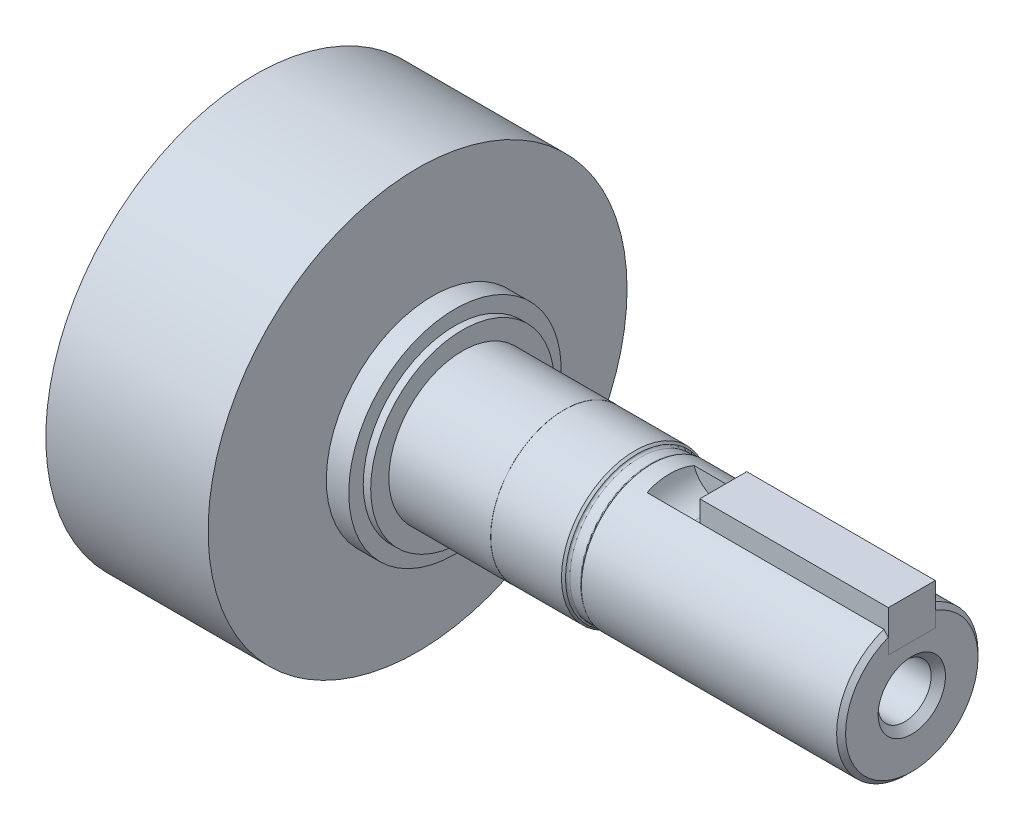
ISO-10303-21;
HEADER;
FILE_DESCRIPTION(('STEP AP214'),'2;1');
FILE_NAME('part.step','',(''),(''),'','','');
FILE_SCHEMA(('AUTOMOTIVE_DESIGN { 1 0 10303 214 1 1 1 1 }'));
ENDSEC;
DATA;
#1=APPLICATION_CONTEXT('core data for automotive mechanical design processes');
#2=APPLICATION_PROTOCOL_DEFINITION('international standard','automotive_design',2000,#1);
#3=PRODUCT_CONTEXT('',#1,'mechanical');
#4=PRODUCT('Part','Part','',(#3));
#5=PRODUCT_RELATED_PRODUCT_CATEGORY('part','',(#4));
#6=PRODUCT_DEFINITION_FORMATION('','',#4);
#7=PRODUCT_DEFINITION_CONTEXT('part definition',#1,'design');
#8=PRODUCT_DEFINITION('design','',#6,#7);
#9=PRODUCT_DEFINITION_SHAPE('','',#8);
#10=(LENGTH_UNIT() NAMED_UNIT(*) SI_UNIT(.MILLI.,.METRE.));
#11=(NAMED_UNIT(*) PLANE_ANGLE_UNIT() SI_UNIT($,.RADIAN.));
#12=(NAMED_UNIT(*) SI_UNIT($,.STERADIAN.) SOLID_ANGLE_UNIT());
#13=UNCERTAINTY_MEASURE_WITH_UNIT(LENGTH_MEASURE(1.E-05),#10,'distance_accuracy_value','');
#14=(GEOMETRIC_REPRESENTATION_CONTEXT(3) GLOBAL_UNCERTAINTY_ASSIGNED_CONTEXT((#13)) GLOBAL_UNIT_ASSIGNED_CONTEXT((#10,
#11,#12)) REPRESENTATION_CONTEXT('',''));
#15=CARTESIAN_POINT('',(0.,0.,0.));
#16=DIRECTION('',(0.,0.,1.));
#17=DIRECTION('',(1.,0.,0.));
#18=AXIS2_PLACEMENT_3D('',#15,#16,#17);
#19=CARTESIAN_POINT('',(-32.004,7.8994,3.9878));
#20=DIRECTION('',(0.,0.,1.));
#21=DIRECTION('',(1.,0.,0.));
#22=AXIS2_PLACEMENT_3D('',#19,#20,#21);
#23=PLANE('',#22);
#24=DIRECTION('',(0.,-1.,0.));
#25=VECTOR('',#24,1.);
#26=CARTESIAN_POINT('',(0.,7.8994,3.9878));
#27=LINE('',#26,#25);
#28=CARTESIAN_POINT('',(0.,14.8844,3.9878));
#29=VERTEX_POINT('',#28);
#30=CARTESIAN_POINT('',(0.,7.8994,3.9878));
#31=VERTEX_POINT('',#30);
#32=EDGE_CURVE('E108',#29,#31,#27,.T.);
#33=ORIENTED_EDGE('',*,*,#32,.F.);
#34=DIRECTION('',(1.,0.,0.));
#35=VECTOR('',#34,1.);
#36=CARTESIAN_POINT('',(-32.004,14.8844,3.9878));
#37=LINE('',#36,#35);
#38=CARTESIAN_POINT('',(-32.004,14.8844,3.9878));
#39=VERTEX_POINT('',#38);
#40=EDGE_CURVE('E12',#39,#29,#37,.T.);
#41=ORIENTED_EDGE('',*,*,#40,.F.);
#42=DIRECTION('',(0.,-1.,0.));
#43=VECTOR('',#42,1.);
#44=CARTESIAN_POINT('',(-32.004,7.8994,3.9878));
#45=LINE('',#44,#43);
#46=CARTESIAN_POINT('',(-32.004,7.8994,3.9878));
#47=VERTEX_POINT('',#46);
#48=EDGE_CURVE('E102',#39,#47,#45,.T.);
#49=ORIENTED_EDGE('',*,*,#48,.T.);
#50=DIRECTION('',(1.,0.,0.));
#51=VECTOR('',#50,1.);
#52=CARTESIAN_POINT('',(-32.004,7.8994,3.9878));
#53=LINE('',#52,#51);
#54=EDGE_CURVE('E47',#47,#31,#53,.T.);
#55=ORIENTED_EDGE('',*,*,#54,.T.);
#56=EDGE_LOOP('',(#33,#41,#49,#55));
#57=FACE_BOUND('',#56,.T.);
#58=ADVANCED_FACE('F44',(#57),#23,.T.);
#59=CARTESIAN_POINT('',(-32.004,14.8844,3.9878));
#60=DIRECTION('',(0.,1.,0.));
#61=DIRECTION('',(0.,0.,1.));
#62=AXIS2_PLACEMENT_3D('',#59,#60,#61);
#63=PLANE('',#62);
#64=DIRECTION('',(0.,0.,1.));
#65=VECTOR('',#64,1.);
#66=CARTESIAN_POINT('',(0.,14.8844,3.9878));
#67=LINE('',#66,#65);
#68=CARTESIAN_POINT('',(0.,14.8844,-3.9878));
#69=VERTEX_POINT('',#68);
#70=EDGE_CURVE('E104',#69,#29,#67,.T.);
#71=ORIENTED_EDGE('',*,*,#70,.F.);
#72=DIRECTION('',(1.,0.,0.));
#73=VECTOR('',#72,1.);
#74=CARTESIAN_POINT('',(-32.004,14.8844,-3.9878));
#75=LINE('',#74,#73);
#76=CARTESIAN_POINT('',(-32.004,14.8844,-3.9878));
#77=VERTEX_POINT('',#76);
#78=EDGE_CURVE('E53',#77,#69,#75,.T.);
#79=ORIENTED_EDGE('',*,*,#78,.F.);
#80=DIRECTION('',(0.,0.,1.));
#81=VECTOR('',#80,1.);
#82=CARTESIAN_POINT('',(-32.004,14.8844,3.9878));
#83=LINE('',#82,#81);
#84=EDGE_CURVE('E99',#77,#39,#83,.T.);
#85=ORIENTED_EDGE('',*,*,#84,.T.);
#86=ORIENTED_EDGE('',*,*,#40,.T.);
#87=EDGE_LOOP('',(#71,#79,#85,#86));
#88=FACE_BOUND('',#87,.T.);
#89=ADVANCED_FACE('F118',(#88),#63,.T.);
#90=CARTESIAN_POINT('',(-32.004,7.8994,-3.9878));
#91=DIRECTION('',(0.,0.,-1.));
#92=DIRECTION('',(-1.,0.,0.));
#93=AXIS2_PLACEMENT_3D('',#90,#91,#92);
#94=PLANE('',#93);
#95=DIRECTION('',(0.,1.,0.));
#96=VECTOR('',#95,1.);
#97=CARTESIAN_POINT('',(0.,7.8994,-3.9878));
#98=LINE('',#97,#96);
#99=CARTESIAN_POINT('',(0.,7.8994,-3.9878));
#100=VERTEX_POINT('',#99);
#101=EDGE_CURVE('E94',#100,#69,#98,.T.);
#102=ORIENTED_EDGE('',*,*,#101,.F.);
#103=DIRECTION('',(1.,0.,0.));
#104=VECTOR('',#103,1.);
#105=CARTESIAN_POINT('',(-32.004,7.8994,-3.9878));
#106=LINE('',#105,#104);
#107=CARTESIAN_POINT('',(-32.004,7.8994,-3.9878));
#108=VERTEX_POINT('',#107);
#109=EDGE_CURVE('E89',#108,#100,#106,.T.);
#110=ORIENTED_EDGE('',*,*,#109,.F.);
#111=DIRECTION('',(0.,1.,0.));
#112=VECTOR('',#111,1.);
#113=CARTESIAN_POINT('',(-32.004,7.8994,-3.9878));
#114=LINE('',#113,#112);
#115=EDGE_CURVE('E92',#108,#77,#114,.T.);
#116=ORIENTED_EDGE('',*,*,#115,.T.);
#117=ORIENTED_EDGE('',*,*,#78,.T.);
#118=EDGE_LOOP('',(#102,#110,#116,#117));
#119=FACE_BOUND('',#118,.T.);
#120=ADVANCED_FACE('F91',(#119),#94,.T.);
#121=CARTESIAN_POINT('',(-32.004,7.8994,3.9878));
#122=DIRECTION('',(0.,-1.,0.));
#123=DIRECTION('',(0.,0.,-1.));
#124=AXIS2_PLACEMENT_3D('',#121,#122,#123);
#125=PLANE('',#124);
#126=DIRECTION('',(0.,0.,-1.));
#127=VECTOR('',#126,1.);
#128=CARTESIAN_POINT('',(0.,7.8994,3.9878));
#129=LINE('',#128,#127);
#130=EDGE_CURVE('E111',#31,#100,#129,.T.);
#131=ORIENTED_EDGE('',*,*,#130,.F.);
#132=ORIENTED_EDGE('',*,*,#54,.F.);
#133=DIRECTION('',(0.,0.,-1.));
#134=VECTOR('',#133,1.);
#135=CARTESIAN_POINT('',(-32.004,7.8994,3.9878));
#136=LINE('',#135,#134);
#137=EDGE_CURVE('E98',#47,#108,#136,.T.);
#138=ORIENTED_EDGE('',*,*,#137,.T.);
#139=ORIENTED_EDGE('',*,*,#109,.T.);
#140=EDGE_LOOP('',(#131,#132,#138,#139));
#141=FACE_BOUND('',#140,.T.);
#142=ADVANCED_FACE('F101',(#141),#125,.T.);
#143=CARTESIAN_POINT('',(-32.004,14.8844,3.9878));
#144=DIRECTION('',(-1.,0.,0.));
#145=DIRECTION('',(0.,0.,1.));
#146=AXIS2_PLACEMENT_3D('',#143,#144,#145);
#147=PLANE('',#146);
#148=ORIENTED_EDGE('',*,*,#48,.F.);
#149=ORIENTED_EDGE('',*,*,#84,.F.);
#150=ORIENTED_EDGE('',*,*,#115,.F.);
#151=ORIENTED_EDGE('',*,*,#137,.F.);
#152=EDGE_LOOP('',(#148,#149,#150,#151));
#153=FACE_BOUND('',#152,.T.);
#154=ADVANCED_FACE('F97',(#153),#147,.T.);
#155=CARTESIAN_POINT('',(0.,14.8844,3.9878));
#156=DIRECTION('',(-1.,0.,0.));
#157=DIRECTION('',(0.,0.,1.));
#158=AXIS2_PLACEMENT_3D('',#155,#156,#157);
#159=PLANE('',#158);
#160=ORIENTED_EDGE('',*,*,#32,.T.);
#161=ORIENTED_EDGE('',*,*,#130,.T.);
#162=ORIENTED_EDGE('',*,*,#101,.T.);
#163=ORIENTED_EDGE('',*,*,#70,.T.);
#164=EDGE_LOOP('',(#160,#161,#162,#163));
#165=FACE_BOUND('',#164,.T.);
#166=ADVANCED_FACE('F117',(#165),#159,.F.);
#167=CLOSED_SHELL('',(#58,#89,#120,#142,#154,#166));
#168=MANIFOLD_SOLID_BREP('B2',#167);
#169=CARTESIAN_POINT('',(-76.2762,0.,0.));
#170=DIRECTION('',(-1.,0.,0.));
#171=DIRECTION('',(0.,0.,1.));
#172=AXIS2_PLACEMENT_3D('',#169,#170,#171);
#173=CYLINDRICAL_SURFACE('',#172,12.4714);
#174=CARTESIAN_POINT('',(-47.0029081687529,0.,0.));
#175=DIRECTION('',(-1.,0.,0.));
#176=DIRECTION('',(0.,-1.,0.));
#177=AXIS2_PLACEMENT_3D('',#174,#175,#176);
#178=CIRCLE('',#177,12.4714);
#179=CARTESIAN_POINT('',(-47.0029081687529,-12.4714,0.));
#180=VERTEX_POINT('',#179);
#181=EDGE_CURVE('E175',#180,#180,#178,.T.);
#182=ORIENTED_EDGE('',*,*,#181,.T.);
#183=EDGE_LOOP('',(#182));
#184=FACE_BOUND('',#183,.T.);
#185=CARTESIAN_POINT('',(-59.0042,0.,0.));
#186=DIRECTION('',(-1.,0.,0.));
#187=DIRECTION('',(0.,0.,1.));
#188=AXIS2_PLACEMENT_3D('',#185,#186,#187);
#189=CIRCLE('',#188,12.4714);
#190=CARTESIAN_POINT('',(-59.0042,0.,12.4714));
#191=VERTEX_POINT('',#190);
#192=EDGE_CURVE('E264',#191,#191,#189,.T.);
#193=ORIENTED_EDGE('',*,*,#192,.F.);
#194=EDGE_LOOP('',(#193));
#195=FACE_BOUND('',#194,.T.);
#196=ADVANCED_FACE('F167',(#184,#195),#173,.T.);
#197=CARTESIAN_POINT('',(-83.6618959007992,0.,0.));
#198=DIRECTION('',(-1.,0.,0.));
#199=DIRECTION('',(0.,0.,1.));
#200=AXIS2_PLACEMENT_3D('',#197,#198,#199);
#201=CYLINDRICAL_SURFACE('',#200,12.4968);
#202=CARTESIAN_POINT('',(-76.2762,0.,0.));
#203=DIRECTION('',(-1.,0.,0.));
#204=DIRECTION('',(0.,0.,1.));
#205=AXIS2_PLACEMENT_3D('',#202,#203,#204);
#206=CIRCLE('',#205,12.4968);
#207=CARTESIAN_POINT('',(-76.2762,0.,12.4968));
#208=VERTEX_POINT('',#207);
#209=EDGE_CURVE('E270',#208,#208,#206,.T.);
#210=ORIENTED_EDGE('',*,*,#209,.F.);
#211=EDGE_LOOP('',(#210));
#212=FACE_BOUND('',#211,.T.);
#213=CARTESIAN_POINT('',(-59.0042,0.,0.));
#214=DIRECTION('',(-1.,0.,0.));
#215=DIRECTION('',(0.,0.,1.));
#216=AXIS2_PLACEMENT_3D('',#213,#214,#215);
#217=CIRCLE('',#216,12.4968);
#218=CARTESIAN_POINT('',(-59.0042,0.,12.4968));
#219=VERTEX_POINT('',#218);
#220=EDGE_CURVE('E267',#219,#219,#217,.T.);
#221=ORIENTED_EDGE('',*,*,#220,.T.);
#222=EDGE_LOOP('',(#221));
#223=FACE_BOUND('',#222,.T.);
#224=ADVANCED_FACE('F361',(#212,#223),#201,.T.);
#225=CARTESIAN_POINT('',(-83.8962,0.,0.));
#226=DIRECTION('',(1.,0.,0.));
#227=DIRECTION('',(0.,0.,-1.));
#228=AXIS2_PLACEMENT_3D('',#225,#226,#227);
#229=CYLINDRICAL_SURFACE('',#228,18.034);
#230=CARTESIAN_POINT('',(-81.3562,0.,0.));
#231=DIRECTION('',(-1.,0.,0.));
#232=DIRECTION('',(0.,-1.,0.));
#233=AXIS2_PLACEMENT_3D('',#230,#231,#232);
#234=CIRCLE('',#233,18.034);
#235=CARTESIAN_POINT('',(-81.3562,-18.034,0.));
#236=VERTEX_POINT('',#235);
#237=EDGE_CURVE('E282',#236,#236,#234,.T.);
#238=ORIENTED_EDGE('',*,*,#237,.F.);
#239=EDGE_LOOP('',(#238));
#240=FACE_BOUND('',#239,.T.);
#241=CARTESIAN_POINT('',(-77.5462,0.,0.));
#242=DIRECTION('',(-1.,0.,0.));
#243=DIRECTION('',(0.,0.,1.));
#244=AXIS2_PLACEMENT_3D('',#241,#242,#243);
#245=CIRCLE('',#244,18.034);
#246=CARTESIAN_POINT('',(-77.5462,0.,18.034));
#247=VERTEX_POINT('',#246);
#248=EDGE_CURVE('E279',#247,#247,#245,.T.);
#249=ORIENTED_EDGE('',*,*,#248,.T.);
#250=EDGE_LOOP('',(#249));
#251=FACE_BOUND('',#250,.T.);
#252=ADVANCED_FACE('F370',(#240,#251),#229,.T.);
#253=CARTESIAN_POINT('',(-83.8962,0.,0.));
#254=DIRECTION('',(-1.,0.,0.));
#255=DIRECTION('',(0.,-1.,0.));
#256=AXIS2_PLACEMENT_3D('',#253,#254,#255);
#257=CYLINDRICAL_SURFACE('',#256,8.4963);
#258=CARTESIAN_POINT('',(-83.3882,0.,0.));
#259=DIRECTION('',(1.,0.,0.));
#260=DIRECTION('',(0.,1.,0.));
#261=AXIS2_PLACEMENT_3D('',#258,#259,#260);
#262=CIRCLE('',#261,8.4963);
#263=CARTESIAN_POINT('',(-83.3882,8.4963,0.));
#264=VERTEX_POINT('',#263);
#265=EDGE_CURVE('E634',#264,#264,#262,.T.);
#266=ORIENTED_EDGE('',*,*,#265,.T.);
#267=EDGE_LOOP('',(#266));
#268=FACE_BOUND('',#267,.T.);
#269=CARTESIAN_POINT('',(-82.3722,0.,0.));
#270=DIRECTION('',(-1.,0.,0.));
#271=DIRECTION('',(0.,-1.,0.));
#272=AXIS2_PLACEMENT_3D('',#269,#270,#271);
#273=CIRCLE('',#272,8.4963);
#274=CARTESIAN_POINT('',(-82.3722,-8.4963,0.));
#275=VERTEX_POINT('',#274);
#276=EDGE_CURVE('E291',#275,#275,#273,.T.);
#277=ORIENTED_EDGE('',*,*,#276,.T.);
#278=EDGE_LOOP('',(#277));
#279=FACE_BOUND('',#278,.T.);
#280=ADVANCED_FACE('F394',(#268,#279),#257,.T.);
#281=CARTESIAN_POINT('',(-82.3722,8.4963,0.));
#282=DIRECTION('',(1.,0.,0.));
#283=DIRECTION('',(0.,1.,0.));
#284=AXIS2_PLACEMENT_3D('',#281,#282,#283);
#285=PLANE('',#284);
#286=CARTESIAN_POINT('',(-82.3722,0.,0.));
#287=DIRECTION('',(-1.,0.,0.));
#288=DIRECTION('',(0.,-1.,0.));
#289=AXIS2_PLACEMENT_3D('',#286,#287,#288);
#290=CIRCLE('',#289,8.3185);
#291=CARTESIAN_POINT('',(-82.3722,-8.3185,0.));
#292=VERTEX_POINT('',#291);
#293=EDGE_CURVE('E288',#292,#292,#290,.T.);
#294=ORIENTED_EDGE('',*,*,#293,.T.);
#295=EDGE_LOOP('',(#294));
#296=FACE_BOUND('',#295,.T.);
#297=ORIENTED_EDGE('',*,*,#276,.F.);
#298=EDGE_LOOP('',(#297));
#299=FACE_BOUND('',#298,.T.);
#300=ADVANCED_FACE('F390',(#296,#299),#285,.T.);
#301=CARTESIAN_POINT('',(-83.8962,0.,0.));
#302=DIRECTION('',(-1.,0.,0.));
#303=DIRECTION('',(0.,-1.,0.));
#304=AXIS2_PLACEMENT_3D('',#301,#302,#303);
#305=CYLINDRICAL_SURFACE('',#304,8.3185);
#306=CARTESIAN_POINT('',(-81.3562,0.,0.));
#307=DIRECTION('',(-1.,0.,0.));
#308=DIRECTION('',(0.,-1.,0.));
#309=AXIS2_PLACEMENT_3D('',#306,#307,#308);
#310=CIRCLE('',#309,8.3185);
#311=CARTESIAN_POINT('',(-81.3562,-8.3185,0.));
#312=VERTEX_POINT('',#311);
#313=EDGE_CURVE('E285',#312,#312,#310,.T.);
#314=ORIENTED_EDGE('',*,*,#313,.T.);
#315=EDGE_LOOP('',(#314));
#316=FACE_BOUND('',#315,.T.);
#317=ORIENTED_EDGE('',*,*,#293,.F.);
#318=EDGE_LOOP('',(#317));
#319=FACE_BOUND('',#318,.T.);
#320=ADVANCED_FACE('F386',(#316,#319),#305,.T.);
#321=CARTESIAN_POINT('',(-81.3562,8.3185,0.));
#322=DIRECTION('',(-1.,0.,0.));
#323=DIRECTION('',(0.,-1.,0.));
#324=AXIS2_PLACEMENT_3D('',#321,#322,#323);
#325=PLANE('',#324);
#326=ORIENTED_EDGE('',*,*,#237,.T.);
#327=EDGE_LOOP('',(#326));
#328=FACE_BOUND('',#327,.T.);
#329=ORIENTED_EDGE('',*,*,#313,.F.);
#330=EDGE_LOOP('',(#329));
#331=FACE_BOUND('',#330,.T.);
#332=ADVANCED_FACE('F382',(#328,#331),#325,.T.);
#333=CARTESIAN_POINT('',(-77.5462,18.034,0.));
#334=DIRECTION('',(1.,0.,0.));
#335=DIRECTION('',(0.,0.,-1.));
#336=AXIS2_PLACEMENT_3D('',#333,#334,#335);
#337=PLANE('',#336);
#338=CARTESIAN_POINT('',(-77.5462,0.,0.));
#339=DIRECTION('',(-1.,0.,0.));
#340=DIRECTION('',(0.,0.,1.));
#341=AXIS2_PLACEMENT_3D('',#338,#339,#340);
#342=CIRCLE('',#341,15.5829);
#343=CARTESIAN_POINT('',(-77.5462,0.,15.5829));
#344=VERTEX_POINT('',#343);
#345=EDGE_CURVE('E276',#344,#344,#342,.T.);
#346=ORIENTED_EDGE('',*,*,#345,.T.);
#347=EDGE_LOOP('',(#346));
#348=FACE_BOUND('',#347,.T.);
#349=ORIENTED_EDGE('',*,*,#248,.F.);
#350=EDGE_LOOP('',(#349));
#351=FACE_BOUND('',#350,.T.);
#352=ADVANCED_FACE('F378',(#348,#351),#337,.T.);
#353=CARTESIAN_POINT('',(-83.6618959007992,0.,0.));
#354=DIRECTION('',(-1.,0.,0.));
#355=DIRECTION('',(0.,0.,1.));
#356=AXIS2_PLACEMENT_3D('',#353,#354,#355);
#357=CYLINDRICAL_SURFACE('',#356,15.5829);
#358=CARTESIAN_POINT('',(-76.2762,0.,0.));
#359=DIRECTION('',(-1.,0.,0.));
#360=DIRECTION('',(0.,0.,1.));
#361=AXIS2_PLACEMENT_3D('',#358,#359,#360);
#362=CIRCLE('',#361,15.5829);
#363=CARTESIAN_POINT('',(-76.2762,0.,15.5829));
#364=VERTEX_POINT('',#363);
#365=EDGE_CURVE('E273',#364,#364,#362,.T.);
#366=ORIENTED_EDGE('',*,*,#365,.T.);
#367=EDGE_LOOP('',(#366));
#368=FACE_BOUND('',#367,.T.);
#369=ORIENTED_EDGE('',*,*,#345,.F.);
#370=EDGE_LOOP('',(#369));
#371=FACE_BOUND('',#370,.T.);
#372=ADVANCED_FACE('F374',(#368,#371),#357,.T.);
#373=CARTESIAN_POINT('',(-76.2762,15.5829,0.));
#374=DIRECTION('',(1.,0.,0.));
#375=DIRECTION('',(0.,0.,-1.));
#376=AXIS2_PLACEMENT_3D('',#373,#374,#375);
#377=PLANE('',#376);
#378=ORIENTED_EDGE('',*,*,#209,.T.);
#379=EDGE_LOOP('',(#378));
#380=FACE_BOUND('',#379,.T.);
#381=ORIENTED_EDGE('',*,*,#365,.F.);
#382=EDGE_LOOP('',(#381));
#383=FACE_BOUND('',#382,.T.);
#384=ADVANCED_FACE('F366',(#380,#383),#377,.T.);
#385=CARTESIAN_POINT('',(-59.0042,12.4968,0.));
#386=DIRECTION('',(1.,0.,0.));
#387=DIRECTION('',(0.,0.,-1.));
#388=AXIS2_PLACEMENT_3D('',#385,#386,#387);
#389=PLANE('',#388);
#390=ORIENTED_EDGE('',*,*,#192,.T.);
#391=EDGE_LOOP('',(#390));
#392=FACE_BOUND('',#391,.T.);
#393=ORIENTED_EDGE('',*,*,#220,.F.);
#394=EDGE_LOOP('',(#393));
#395=FACE_BOUND('',#394,.T.);
#396=ADVANCED_FACE('F363',(#392,#395),#389,.T.);
#397=CARTESIAN_POINT('',(-77.5462,0.,0.));
#398=DIRECTION('',(-1.,0.,0.));
#399=DIRECTION('',(0.,0.,1.));
#400=AXIS2_PLACEMENT_3D('',#397,#398,#399);
#401=CYLINDRICAL_SURFACE('',#400,11.8237);
#402=CARTESIAN_POINT('',(-44.4304104165052,0.,0.));
#403=DIRECTION('',(1.,0.,0.));
#404=DIRECTION('',(0.,0.,-1.));
#405=AXIS2_PLACEMENT_3D('',#402,#403,#404);
#406=CIRCLE('',#405,11.8237);
#407=CARTESIAN_POINT('',(-44.4304104165052,0.,-11.8237));
#408=VERTEX_POINT('',#407);
#409=EDGE_CURVE('E303',#408,#408,#406,.F.);
#410=ORIENTED_EDGE('',*,*,#409,.T.);
#411=EDGE_LOOP('',(#410));
#412=FACE_BOUND('',#411,.T.);
#413=CARTESIAN_POINT('',(-46.228,0.,0.));
#414=DIRECTION('',(1.,0.,0.));
#415=DIRECTION('',(0.,1.,0.));
#416=AXIS2_PLACEMENT_3D('',#413,#414,#415);
#417=CIRCLE('',#416,11.8237);
#418=CARTESIAN_POINT('',(-46.228,11.8237,0.));
#419=VERTEX_POINT('',#418);
#420=EDGE_CURVE('E300',#419,#419,#417,.T.);
#421=ORIENTED_EDGE('',*,*,#420,.T.);
#422=EDGE_LOOP('',(#421));
#423=FACE_BOUND('',#422,.T.);
#424=ADVANCED_FACE('F357',(#412,#423),#401,.T.);
#425=CARTESIAN_POINT('',(0.,0.,0.));
#426=DIRECTION('',(1.,0.,0.));
#427=DIRECTION('',(0.,0.,-1.));
#428=AXIS2_PLACEMENT_3D('',#425,#426,#427);
#429=PLANE('',#428);
#430=DIRECTION('',(0.,1.,0.));
#431=VECTOR('',#430,1.);
#432=CARTESIAN_POINT('',(0.,12.0015,-3.9878));
#433=LINE('',#432,#431);
#434=CARTESIAN_POINT('',(0.,7.8994,-3.9878));
#435=VERTEX_POINT('',#434);
#436=CARTESIAN_POINT('',(0.,10.5082734742678,-3.9878));
#437=VERTEX_POINT('',#436);
#438=EDGE_CURVE('E235',#435,#437,#433,.T.);
#439=ORIENTED_EDGE('',*,*,#438,.F.);
#440=DIRECTION('',(0.,0.,1.));
#441=VECTOR('',#440,1.);
#442=CARTESIAN_POINT('',(0.,7.8994,-3.9878));
#443=LINE('',#442,#441);
#444=CARTESIAN_POINT('',(0.,7.8994,3.9878));
#445=VERTEX_POINT('',#444);
#446=EDGE_CURVE('E234',#435,#445,#443,.T.);
#447=ORIENTED_EDGE('',*,*,#446,.T.);
#448=DIRECTION('',(0.,1.,0.));
#449=VECTOR('',#448,1.);
#450=CARTESIAN_POINT('',(0.,12.0015,3.9878));
#451=LINE('',#450,#449);
#452=CARTESIAN_POINT('',(0.,10.5082734742678,3.9878));
#453=VERTEX_POINT('',#452);
#454=EDGE_CURVE('E225',#445,#453,#451,.T.);
#455=ORIENTED_EDGE('',*,*,#454,.T.);
#456=CARTESIAN_POINT('',(0.,0.,0.));
#457=DIRECTION('',(1.,0.,0.));
#458=DIRECTION('',(0.,0.,-1.));
#459=AXIS2_PLACEMENT_3D('',#456,#457,#458);
#460=CIRCLE('',#459,11.2395);
#461=EDGE_CURVE('E297',#453,#437,#460,.T.);
#462=ORIENTED_EDGE('',*,*,#461,.T.);
#463=EDGE_LOOP('',(#439,#447,#455,#462));
#464=FACE_BOUND('',#463,.T.);
#465=CARTESIAN_POINT('',(0.,0.,0.));
#466=DIRECTION('',(1.,0.,0.));
#467=DIRECTION('',(0.,0.,-1.));
#468=AXIS2_PLACEMENT_3D('',#465,#466,#467);
#469=CIRCLE('',#468,5.715);
#470=CARTESIAN_POINT('',(0.,0.,-5.715));
#471=VERTEX_POINT('',#470);
#472=EDGE_CURVE('E252',#471,#471,#469,.T.);
#473=ORIENTED_EDGE('',*,*,#472,.F.);
#474=EDGE_LOOP('',(#473));
#475=FACE_BOUND('',#474,.T.);
#476=ADVANCED_FACE('F355',(#464,#475),#429,.T.);
#477=CARTESIAN_POINT('',(-81.3562,0.,0.));
#478=DIRECTION('',(-1.,0.,0.));
#479=DIRECTION('',(0.,-1.,0.));
#480=AXIS2_PLACEMENT_3D('',#477,#478,#479);
#481=CYLINDRICAL_SURFACE('',#480,12.0015);
#482=DIRECTION('',(-1.,0.,0.));
#483=VECTOR('',#482,1.);
#484=CARTESIAN_POINT('',(-81.3562,11.3196048256995,-3.9878));
#485=LINE('',#484,#483);
#486=CARTESIAN_POINT('',(-0.761999999999985,11.3196048256995,-3.9878));
#487=VERTEX_POINT('',#486);
#488=CARTESIAN_POINT('',(-40.9501956315124,11.3196048256995,-3.9878));
#489=VERTEX_POINT('',#488);
#490=EDGE_CURVE('E223',#487,#489,#485,.T.);
#491=ORIENTED_EDGE('',*,*,#490,.F.);
#492=CARTESIAN_POINT('',(-0.761999999999985,0.,0.));
#493=DIRECTION('',(1.,0.,0.));
#494=DIRECTION('',(0.,1.,0.));
#495=AXIS2_PLACEMENT_3D('',#492,#493,#494);
#496=CIRCLE('',#495,12.0015);
#497=CARTESIAN_POINT('',(-0.761999999999985,11.3196048256995,3.9878));
#498=VERTEX_POINT('',#497);
#499=EDGE_CURVE('E294',#487,#498,#496,.F.);
#500=ORIENTED_EDGE('',*,*,#499,.T.);
#501=DIRECTION('',(-1.,0.,0.));
#502=VECTOR('',#501,1.);
#503=CARTESIAN_POINT('',(-81.3562,11.3196048256995,3.9878));
#504=LINE('',#503,#502);
#505=CARTESIAN_POINT('',(-40.9501956315124,11.3196048256995,3.9878));
#506=VERTEX_POINT('',#505);
#507=EDGE_CURVE('E182',#498,#506,#504,.T.);
#508=ORIENTED_EDGE('',*,*,#507,.T.);
#509=CARTESIAN_POINT('',(-40.9501956315124,11.3196048256995,-3.9878));
#510=CARTESIAN_POINT('',(-40.9672643175018,11.3714447659274,-3.84066242832949));
#511=CARTESIAN_POINT('',(-40.982490605827,11.4204704177451,-3.69233320262747));
#512=CARTESIAN_POINT('',(-41.0097786539704,11.5127630237485,-3.39362565455442));
#513=CARTESIAN_POINT('',(-41.0218408175142,11.5560307122724,-3.24324759618185));
#514=CARTESIAN_POINT('',(-41.0433206226141,11.6366742320869,-2.94080013981964));
#515=CARTESIAN_POINT('',(-41.0527393334811,11.6740524430565,-2.78873145166595));
#516=CARTESIAN_POINT('',(-41.0693629734595,11.7428516972853,-2.48313818657857));
#517=CARTESIAN_POINT('',(-41.076567825228,11.7742725324047,-2.32961355897369));
#518=CARTESIAN_POINT('',(-41.0954641129312,11.8596614313507,-1.86633288282402));
#519=CARTESIAN_POINT('',(-41.1043806594575,11.9045258968134,-1.55473203642217));
#520=CARTESIAN_POINT('',(-41.116905628398,11.9696364284138,-0.928890776447839));
#521=CARTESIAN_POINT('',(-41.1205136502981,11.9898806369987,-0.614650165510821));
#522=CARTESIAN_POINT('',(-41.1233674231549,12.0057591694898,0.0202496631983806));
#523=CARTESIAN_POINT('',(-41.1225319987012,12.0009355769896,0.340920949579505));
#524=CARTESIAN_POINT('',(-41.1160855267291,11.9656430210368,0.980865457638995));
#525=CARTESIAN_POINT('',(-41.1104735916326,11.9351692912501,1.30013840839272));
#526=CARTESIAN_POINT('',(-41.0930529549541,11.8489385175845,1.93408878878969));
#527=CARTESIAN_POINT('',(-41.0812630653004,11.7932582973544,2.24877720490103));
#528=CARTESIAN_POINT('',(-41.0488665670454,11.6571187043459,2.87214338198505));
#529=CARTESIAN_POINT('',(-41.028266512964,11.5766777653057,3.1808254333874));
#530=CARTESIAN_POINT('',(-40.9938512697975,11.4586696259065,3.56969264486389));
#531=CARTESIAN_POINT('',(-40.9858865138649,11.4321140806409,3.65384097868191));
#532=CARTESIAN_POINT('',(-40.9688777183072,11.3772046954753,3.82138383316342));
#533=CARTESIAN_POINT('',(-40.9598343114645,11.3488519144402,3.90477876521258));
#534=CARTESIAN_POINT('',(-40.9501956315124,11.3196048256995,3.9878));
#535=B_SPLINE_CURVE_WITH_KNOTS('',3,(#509,#510,#511,#512,#513,#514,#515,#516,#517,#518,#519,
#520,#521,#522,#523,#524,#525,#526,#527,#528,#529,#530,#531,#532,#533,#534),.UNSPECIFIED.,.F.,
.F.,(4,2,2,2,2,2,2,2,2,2,2,2,4),(0.,0.470741603556062,0.941423113717289,1.41191395174783,
1.88242122484363,2.82610947703595,3.76986892433894,4.73092805525516,5.69216581057464,
6.65049345253392,7.6081093619663,7.87388356510304,8.13950261364512),.UNSPECIFIED.);
#536=EDGE_CURVE('E340',#489,#506,#535,.T.);
#537=ORIENTED_EDGE('',*,*,#536,.F.);
#538=EDGE_LOOP('',(#491,#500,#508,#537));
#539=FACE_BOUND('',#538,.T.);
#540=CARTESIAN_POINT('',(-44.0944,0.,0.));
#541=DIRECTION('',(-1.,0.,0.));
#542=DIRECTION('',(0.,0.,1.));
#543=AXIS2_PLACEMENT_3D('',#540,#541,#542);
#544=CIRCLE('',#543,12.0015);
#545=CARTESIAN_POINT('',(-44.0944,0.,12.0015));
#546=VERTEX_POINT('',#545);
#547=EDGE_CURVE('E261',#546,#546,#544,.T.);
#548=ORIENTED_EDGE('',*,*,#547,.F.);
#549=EDGE_LOOP('',(#548));
#550=FACE_BOUND('',#549,.T.);
#551=ADVANCED_FACE('F349',(#539,#550),#481,.T.);
#552=CARTESIAN_POINT('',(-19.05,0.,0.));
#553=DIRECTION('',(1.,0.,0.));
#554=DIRECTION('',(0.,0.,-1.));
#555=AXIS2_PLACEMENT_3D('',#552,#553,#554);
#556=CONICAL_SURFACE('',#555,4.5,1.02974425867665);
#557=CARTESIAN_POINT('',(-21.753872785624,0.,0.));
#558=VERTEX_POINT('',#557);
#559=VERTEX_LOOP('',#558);
#560=FACE_BOUND('',#559,.T.);
#561=CARTESIAN_POINT('',(-19.05,0.,0.));
#562=DIRECTION('',(1.,0.,0.));
#563=DIRECTION('',(0.,0.,-1.));
#564=AXIS2_PLACEMENT_3D('',#561,#562,#563);
#565=CIRCLE('',#564,4.5);
#566=CARTESIAN_POINT('',(-19.05,0.,-4.5));
#567=VERTEX_POINT('',#566);
#568=EDGE_CURVE('E258',#567,#567,#565,.T.);
#569=ORIENTED_EDGE('',*,*,#568,.T.);
#570=EDGE_LOOP('',(#569));
#571=FACE_BOUND('',#570,.T.);
#572=ADVANCED_FACE('F354',(#560,#571),#556,.F.);
#573=CARTESIAN_POINT('',(0.,0.,0.));
#574=DIRECTION('',(1.,0.,0.));
#575=DIRECTION('',(0.,0.,-1.));
#576=AXIS2_PLACEMENT_3D('',#573,#574,#575);
#577=CYLINDRICAL_SURFACE('',#576,4.5);
#578=ORIENTED_EDGE('',*,*,#568,.F.);
#579=EDGE_LOOP('',(#578));
#580=FACE_BOUND('',#579,.T.);
#581=CARTESIAN_POINT('',(-1.215,0.,0.));
#582=DIRECTION('',(1.,0.,0.));
#583=DIRECTION('',(0.,0.,-1.));
#584=AXIS2_PLACEMENT_3D('',#581,#582,#583);
#585=CIRCLE('',#584,4.5);
#586=CARTESIAN_POINT('',(-1.215,0.,-4.5));
#587=VERTEX_POINT('',#586);
#588=EDGE_CURVE('E255',#587,#587,#585,.T.);
#589=ORIENTED_EDGE('',*,*,#588,.T.);
#590=EDGE_LOOP('',(#589));
#591=FACE_BOUND('',#590,.T.);
#592=ADVANCED_FACE('F475',(#580,#591),#577,.F.);
#593=CARTESIAN_POINT('',(0.,0.,0.));
#594=DIRECTION('',(1.,0.,0.));
#595=DIRECTION('',(0.,0.,-1.));
#596=AXIS2_PLACEMENT_3D('',#593,#594,#595);
#597=CONICAL_SURFACE('',#596,5.715,0.785398163397448);
#598=ORIENTED_EDGE('',*,*,#588,.F.);
#599=EDGE_LOOP('',(#598));
#600=FACE_BOUND('',#599,.T.);
#601=ORIENTED_EDGE('',*,*,#472,.T.);
#602=EDGE_LOOP('',(#601));
#603=FACE_BOUND('',#602,.T.);
#604=ADVANCED_FACE('F338',(#600,#603),#597,.F.);
#605=CARTESIAN_POINT('',(-0.761999999999985,0.,0.));
#606=DIRECTION('',(-1.,0.,0.));
#607=DIRECTION('',(0.,-1.,0.));
#608=AXIS2_PLACEMENT_3D('',#605,#606,#607);
#609=CONICAL_SURFACE('',#608,12.0015,0.785398163397448);
#610=CARTESIAN_POINT('',(4.94927041492594,4.86461091896784,-3.9878));
#611=CARTESIAN_POINT('',(4.85058682772503,4.99219229035126,-3.9878));
#612=CARTESIAN_POINT('',(4.75095179225004,5.11903156137986,-3.9878));
#613=CARTESIAN_POINT('',(4.55005566339911,5.37140656751434,-3.9878));
#614=CARTESIAN_POINT('',(4.4487946496375,5.49694236595079,-3.9878));
#615=CARTESIAN_POINT('',(4.24493196596541,5.74688113536501,-3.9878));
#616=CARTESIAN_POINT('',(4.14233053932345,5.87128430513341,-3.9878));
#617=CARTESIAN_POINT('',(3.93596887044452,6.11912778660759,-3.9878));
#618=CARTESIAN_POINT('',(3.83220861194728,6.24256808476136,-3.9878));
#619=CARTESIAN_POINT('',(3.51954208719525,6.61152805313896,-3.9878));
#620=CARTESIAN_POINT('',(3.30915965076959,6.85579702866825,-3.9878));
#621=CARTESIAN_POINT('',(2.88544867077178,7.34178082807649,-3.9878));
#622=CARTESIAN_POINT('',(2.67211996952562,7.58349551402714,-3.9878));
#623=CARTESIAN_POINT('',(2.24332722517111,8.06476930335063,-3.9878));
#624=CARTESIAN_POINT('',(2.02786449467168,8.30432957749506,-3.9878));
#625=CARTESIAN_POINT('',(1.59517228235553,8.78183891362752,-3.9878));
#626=CARTESIAN_POINT('',(1.37794283414041,9.01978800610196,-3.9878));
#627=CARTESIAN_POINT('',(0.942040833875313,9.49441584157099,-3.9878));
#628=CARTESIAN_POINT('',(0.72336810064238,9.73109441803854,-3.9878));
#629=CARTESIAN_POINT('',(0.284870527638916,10.203383215479,-3.9878));
#630=CARTESIAN_POINT('',(0.0650456823173134,10.4389934312942,-3.9878));
#631=CARTESIAN_POINT('',(-0.595549822248243,11.1441941374858,-3.9878));
#632=CARTESIAN_POINT('',(-1.03772822823233,11.6124657755787,-3.9878));
#633=CARTESIAN_POINT('',(-1.92468248661287,12.5464908210076,-3.9878));
#634=CARTESIAN_POINT('',(-2.36945820044633,13.0122443601736,-3.9878));
#635=CARTESIAN_POINT('',(-3.26112829419978,13.9421366868341,-3.9878));
#636=CARTESIAN_POINT('',(-3.70802356931043,14.4062746153226,-3.9878));
#637=CARTESIAN_POINT('',(-4.60329840938406,15.3331559803416,-3.9878));
#638=CARTESIAN_POINT('',(-5.05167803769335,15.7958993557053,-3.9878));
#639=CARTESIAN_POINT('',(-5.50056684746992,16.2581453191243,-3.9878));
#640=B_SPLINE_CURVE_WITH_KNOTS('',3,(#610,#611,#612,#613,#614,#615,#616,#617,#618,#619,#620,
#621,#622,#623,#624,#625,#626,#627,#628,#629,#630,#631,#632,#633,#634,#635,#636,#637,#638,#639),
.UNSPECIFIED.,.F.,.F.,(4,2,2,2,2,2,2,2,2,2,2,2,2,2,4),(0.,0.483867650632815,0.967711680999321,
1.45146908691277,1.93523328926248,2.90233403254388,3.86948673385783,4.83607753412801,
5.80264999338985,6.76934619116521,7.73604705093673,9.66817949703519,11.6002097912876,
13.5331454919637,15.4661647743438),.UNSPECIFIED.);
#641=EDGE_CURVE('E314',#437,#487,#640,.T.);
#642=ORIENTED_EDGE('',*,*,#641,.F.);
#643=ORIENTED_EDGE('',*,*,#461,.F.);
#644=CARTESIAN_POINT('',(4.94927041492594,4.86461091896784,3.9878));
#645=CARTESIAN_POINT('',(4.85058682772503,4.99219229035126,3.9878));
#646=CARTESIAN_POINT('',(4.75095179225004,5.11903156137986,3.9878));
#647=CARTESIAN_POINT('',(4.55005566339911,5.37140656751434,3.9878));
#648=CARTESIAN_POINT('',(4.4487946496375,5.49694236595079,3.9878));
#649=CARTESIAN_POINT('',(4.24493196596541,5.74688113536501,3.9878));
#650=CARTESIAN_POINT('',(4.14233053932345,5.87128430513341,3.9878));
#651=CARTESIAN_POINT('',(3.93596887044452,6.11912778660759,3.9878));
#652=CARTESIAN_POINT('',(3.83220861194728,6.24256808476136,3.9878));
#653=CARTESIAN_POINT('',(3.51954208719525,6.61152805313896,3.9878));
#654=CARTESIAN_POINT('',(3.30915965076959,6.85579702866825,3.9878));
#655=CARTESIAN_POINT('',(2.88544867077178,7.34178082807649,3.9878));
#656=CARTESIAN_POINT('',(2.67211996952562,7.58349551402714,3.9878));
#657=CARTESIAN_POINT('',(2.24332722517111,8.06476930335063,3.9878));
#658=CARTESIAN_POINT('',(2.02786449467168,8.30432957749506,3.9878));
#659=CARTESIAN_POINT('',(1.59517228235553,8.78183891362752,3.9878));
#660=CARTESIAN_POINT('',(1.37794283414041,9.01978800610196,3.9878));
#661=CARTESIAN_POINT('',(0.942040833875313,9.49441584157099,3.9878));
#662=CARTESIAN_POINT('',(0.72336810064238,9.73109441803854,3.9878));
#663=CARTESIAN_POINT('',(0.284870527638916,10.203383215479,3.9878));
#664=CARTESIAN_POINT('',(0.0650456823173134,10.4389934312942,3.9878));
#665=CARTESIAN_POINT('',(-0.595549822248243,11.1441941374858,3.9878));
#666=CARTESIAN_POINT('',(-1.03772822823233,11.6124657755787,3.9878));
#667=CARTESIAN_POINT('',(-1.92468248661287,12.5464908210076,3.9878));
#668=CARTESIAN_POINT('',(-2.36945820044633,13.0122443601736,3.9878));
#669=CARTESIAN_POINT('',(-3.26112829419978,13.9421366868341,3.9878));
#670=CARTESIAN_POINT('',(-3.70802356931043,14.4062746153226,3.9878));
#671=CARTESIAN_POINT('',(-4.60329840938406,15.3331559803416,3.9878));
#672=CARTESIAN_POINT('',(-5.05167803769335,15.7958993557053,3.9878));
#673=CARTESIAN_POINT('',(-5.50056684746992,16.2581453191243,3.9878));
#674=B_SPLINE_CURVE_WITH_KNOTS('',3,(#644,#645,#646,#647,#648,#649,#650,#651,#652,#653,#654,
#655,#656,#657,#658,#659,#660,#661,#662,#663,#664,#665,#666,#667,#668,#669,#670,#671,#672,#673),
.UNSPECIFIED.,.F.,.F.,(4,2,2,2,2,2,2,2,2,2,2,2,2,2,4),(0.,0.483867650632815,0.967711680999321,
1.45146908691277,1.93523328926248,2.90233403254388,3.86948673385783,4.83607753412801,
5.80264999338985,6.76934619116521,7.73604705093673,9.66817949703519,11.6002097912876,
13.5331454919637,15.4661647743438),.UNSPECIFIED.);
#675=EDGE_CURVE('E306',#453,#498,#674,.T.);
#676=ORIENTED_EDGE('',*,*,#675,.T.);
#677=ORIENTED_EDGE('',*,*,#499,.F.);
#678=EDGE_LOOP('',(#642,#643,#676,#677));
#679=FACE_BOUND('',#678,.T.);
#680=ADVANCED_FACE('F321',(#679),#609,.T.);
#681=CARTESIAN_POINT('',(-44.4304104165052,0.,0.));
#682=DIRECTION('',(1.,0.,0.));
#683=DIRECTION('',(0.,0.,-1.));
#684=AXIS2_PLACEMENT_3D('',#681,#682,#683);
#685=TOROIDAL_SURFACE('',#684,12.2301,0.4064);
#686=ORIENTED_EDGE('',*,*,#547,.T.);
#687=EDGE_LOOP('',(#686));
#688=FACE_BOUND('',#687,.T.);
#689=ORIENTED_EDGE('',*,*,#409,.F.);
#690=EDGE_LOOP('',(#689));
#691=FACE_BOUND('',#690,.T.);
#692=ADVANCED_FACE('F491',(#688,#691),#685,.F.);
#693=CARTESIAN_POINT('',(-46.228,0.,0.));
#694=DIRECTION('',(1.,0.,0.));
#695=DIRECTION('',(0.,1.,0.));
#696=AXIS2_PLACEMENT_3D('',#693,#694,#695);
#697=TOROIDAL_SURFACE('',#696,12.2301,0.4064);
#698=CARTESIAN_POINT('',(-46.6279526032264,0.,0.));
#699=DIRECTION('',(1.,0.,0.));
#700=DIRECTION('',(0.,1.,0.));
#701=AXIS2_PLACEMENT_3D('',#698,#699,#700);
#702=CIRCLE('',#701,12.1579967741937);
#703=CARTESIAN_POINT('',(-46.6279526032264,12.1579967741937,0.));
#704=VERTEX_POINT('',#703);
#705=EDGE_CURVE('E42',#704,#704,#702,.T.);
#706=ORIENTED_EDGE('',*,*,#705,.T.);
#707=EDGE_LOOP('',(#706));
#708=FACE_BOUND('',#707,.T.);
#709=ORIENTED_EDGE('',*,*,#420,.F.);
#710=EDGE_LOOP('',(#709));
#711=FACE_BOUND('',#710,.T.);
#712=ADVANCED_FACE('F337',(#708,#711),#697,.F.);
#713=CARTESIAN_POINT('',(-36.2219301610902,12.8778,-3.9878));
#714=DIRECTION('',(0.,0.,1.));
#715=DIRECTION('',(1.,0.,0.));
#716=AXIS2_PLACEMENT_3D('',#713,#714,#715);
#717=CYLINDRICAL_SURFACE('',#716,4.9784);
#718=CARTESIAN_POINT('',(-36.2219301610902,12.8778,-3.9878));
#719=DIRECTION('',(0.,0.,1.));
#720=DIRECTION('',(-1.,0.,0.));
#721=AXIS2_PLACEMENT_3D('',#718,#719,#720);
#722=CIRCLE('',#721,4.9784);
#723=CARTESIAN_POINT('',(-36.2219301610902,7.8994,-3.9878));
#724=VERTEX_POINT('',#723);
#725=EDGE_CURVE('E216',#489,#724,#722,.T.);
#726=ORIENTED_EDGE('',*,*,#725,.F.);
#727=ORIENTED_EDGE('',*,*,#536,.T.);
#728=CARTESIAN_POINT('',(-36.2219301610902,12.8778,3.9878));
#729=DIRECTION('',(0.,0.,1.));
#730=DIRECTION('',(-1.,0.,0.));
#731=AXIS2_PLACEMENT_3D('',#728,#729,#730);
#732=CIRCLE('',#731,4.9784);
#733=CARTESIAN_POINT('',(-36.2219301610902,7.8994,3.9878));
#734=VERTEX_POINT('',#733);
#735=EDGE_CURVE('E230',#506,#734,#732,.T.);
#736=ORIENTED_EDGE('',*,*,#735,.T.);
#737=DIRECTION('',(0.,0.,1.));
#738=VECTOR('',#737,1.);
#739=CARTESIAN_POINT('',(-36.2219301610902,7.8994,-3.9878));
#740=LINE('',#739,#738);
#741=EDGE_CURVE('E228',#724,#734,#740,.T.);
#742=ORIENTED_EDGE('',*,*,#741,.F.);
#743=EDGE_LOOP('',(#726,#727,#736,#742));
#744=FACE_BOUND('',#743,.T.);
#745=ADVANCED_FACE('F229',(#744),#717,.F.);
#746=CARTESIAN_POINT('',(-36.2219301610902,7.8994,-3.9878));
#747=DIRECTION('',(0.,-1.,0.));
#748=DIRECTION('',(1.,0.,0.));
#749=AXIS2_PLACEMENT_3D('',#746,#747,#748);
#750=PLANE('',#749);
#751=DIRECTION('',(1.,0.,0.));
#752=VECTOR('',#751,1.);
#753=CARTESIAN_POINT('',(-36.2219301610902,7.8994,3.9878));
#754=LINE('',#753,#752);
#755=EDGE_CURVE('E244',#734,#445,#754,.T.);
#756=ORIENTED_EDGE('',*,*,#755,.T.);
#757=ORIENTED_EDGE('',*,*,#446,.F.);
#758=DIRECTION('',(1.,0.,0.));
#759=VECTOR('',#758,1.);
#760=CARTESIAN_POINT('',(-36.2219301610902,7.8994,-3.9878));
#761=LINE('',#760,#759);
#762=EDGE_CURVE('E220',#724,#435,#761,.T.);
#763=ORIENTED_EDGE('',*,*,#762,.F.);
#764=ORIENTED_EDGE('',*,*,#741,.T.);
#765=EDGE_LOOP('',(#756,#757,#763,#764));
#766=FACE_BOUND('',#765,.T.);
#767=ADVANCED_FACE('F237',(#766),#750,.F.);
#768=CARTESIAN_POINT('',(-36.2219301610902,12.8778,-3.9878));
#769=DIRECTION('',(0.,0.,-1.));
#770=DIRECTION('',(-1.,0.,0.));
#771=AXIS2_PLACEMENT_3D('',#768,#769,#770);
#772=PLANE('',#771);
#773=ORIENTED_EDGE('',*,*,#490,.T.);
#774=ORIENTED_EDGE('',*,*,#725,.T.);
#775=ORIENTED_EDGE('',*,*,#762,.T.);
#776=ORIENTED_EDGE('',*,*,#438,.T.);
#777=ORIENTED_EDGE('',*,*,#641,.T.);
#778=EDGE_LOOP('',(#773,#774,#775,#776,#777));
#779=FACE_BOUND('',#778,.T.);
#780=ADVANCED_FACE('F218',(#779),#772,.F.);
#781=CARTESIAN_POINT('',(-36.2219301610902,12.8778,3.9878));
#782=DIRECTION('',(0.,0.,-1.));
#783=DIRECTION('',(-1.,0.,0.));
#784=AXIS2_PLACEMENT_3D('',#781,#782,#783);
#785=PLANE('',#784);
#786=ORIENTED_EDGE('',*,*,#675,.F.);
#787=ORIENTED_EDGE('',*,*,#454,.F.);
#788=ORIENTED_EDGE('',*,*,#755,.F.);
#789=ORIENTED_EDGE('',*,*,#735,.F.);
#790=ORIENTED_EDGE('',*,*,#507,.F.);
#791=EDGE_LOOP('',(#786,#787,#788,#789,#790));
#792=FACE_BOUND('',#791,.T.);
#793=ADVANCED_FACE('F325',(#792),#785,.T.);
#794=CARTESIAN_POINT('',(-83.8962,0.,0.));
#795=DIRECTION('',(1.,0.,0.));
#796=DIRECTION('',(0.,1.,0.));
#797=AXIS2_PLACEMENT_3D('',#794,#795,#796);
#798=CONICAL_SURFACE('',#797,7.9883,0.78539816339745);
#799=ORIENTED_EDGE('',*,*,#265,.F.);
#800=EDGE_LOOP('',(#799));
#801=FACE_BOUND('',#800,.T.);
#802=CARTESIAN_POINT('',(-83.8962,0.,0.));
#803=DIRECTION('',(1.,0.,0.));
#804=DIRECTION('',(0.,0.,-1.));
#805=AXIS2_PLACEMENT_3D('',#802,#803,#804);
#806=CIRCLE('',#805,7.9883);
#807=CARTESIAN_POINT('',(-83.8962,0.,-7.9883));
#808=VERTEX_POINT('',#807);
#809=EDGE_CURVE('E347',#808,#808,#806,.F.);
#810=ORIENTED_EDGE('',*,*,#809,.F.);
#811=EDGE_LOOP('',(#810));
#812=FACE_BOUND('',#811,.T.);
#813=ADVANCED_FACE('F329',(#801,#812),#798,.T.);
#814=CARTESIAN_POINT('',(-47.0029081687529,0.,0.));
#815=DIRECTION('',(-1.,0.,0.));
#816=DIRECTION('',(0.,-1.,0.));
#817=AXIS2_PLACEMENT_3D('',#814,#815,#816);
#818=CONICAL_SURFACE('',#817,12.4714,0.696216372432614);
#819=ORIENTED_EDGE('',*,*,#705,.F.);
#820=EDGE_LOOP('',(#819));
#821=FACE_BOUND('',#820,.T.);
#822=ORIENTED_EDGE('',*,*,#181,.F.);
#823=EDGE_LOOP('',(#822));
#824=FACE_BOUND('',#823,.T.);
#825=ADVANCED_FACE('F169',(#821,#824),#818,.T.);
#826=CARTESIAN_POINT('',(-111.4425,0.,0.));
#827=DIRECTION('',(1.,0.,0.));
#828=DIRECTION('',(0.,0.,-1.));
#829=AXIS2_PLACEMENT_3D('',#826,#827,#828);
#830=CYLINDRICAL_SURFACE('',#829,35.56);
#831=CARTESIAN_POINT('',(-111.4425,0.,0.));
#832=DIRECTION('',(1.,0.,0.));
#833=DIRECTION('',(0.,0.,-1.));
#834=AXIS2_PLACEMENT_3D('',#831,#832,#833);
#835=CIRCLE('',#834,35.56);
#836=CARTESIAN_POINT('',(-111.4425,0.,-35.56));
#837=VERTEX_POINT('',#836);
#838=EDGE_CURVE('E245',#837,#837,#835,.T.);
#839=ORIENTED_EDGE('',*,*,#838,.T.);
#840=EDGE_LOOP('',(#839));
#841=FACE_BOUND('',#840,.T.);
#842=CARTESIAN_POINT('',(-83.8962,0.,0.));
#843=DIRECTION('',(1.,0.,0.));
#844=DIRECTION('',(0.,0.,-1.));
#845=AXIS2_PLACEMENT_3D('',#842,#843,#844);
#846=CIRCLE('',#845,35.56);
#847=CARTESIAN_POINT('',(-83.8962,0.,-35.56));
#848=VERTEX_POINT('',#847);
#849=EDGE_CURVE('E628',#848,#848,#846,.T.);
#850=ORIENTED_EDGE('',*,*,#849,.F.);
#851=EDGE_LOOP('',(#850));
#852=FACE_BOUND('',#851,.T.);
#853=ADVANCED_FACE('F532',(#841,#852),#830,.T.);
#854=CARTESIAN_POINT('',(-111.4425,0.,0.));
#855=DIRECTION('',(1.,0.,0.));
#856=DIRECTION('',(0.,0.,-1.));
#857=AXIS2_PLACEMENT_3D('',#854,#855,#856);
#858=PLANE('',#857);
#859=ORIENTED_EDGE('',*,*,#838,.F.);
#860=EDGE_LOOP('',(#859));
#861=FACE_BOUND('',#860,.T.);
#862=ADVANCED_FACE('F540',(#861),#858,.F.);
#863=CARTESIAN_POINT('',(-83.8962,0.,0.));
#864=DIRECTION('',(1.,0.,0.));
#865=DIRECTION('',(0.,0.,-1.));
#866=AXIS2_PLACEMENT_3D('',#863,#864,#865);
#867=PLANE('',#866);
#868=ORIENTED_EDGE('',*,*,#809,.T.);
#869=EDGE_LOOP('',(#868));
#870=FACE_BOUND('',#869,.T.);
#871=ORIENTED_EDGE('',*,*,#849,.T.);
#872=EDGE_LOOP('',(#871));
#873=FACE_BOUND('',#872,.T.);
#874=ADVANCED_FACE('F547',(#870,#873),#867,.T.);
#875=CLOSED_SHELL('',(#196,#224,#252,#280,#300,#320,#332,#352,#372,#384,#396,#424,#476,#551,
#572,#592,#604,#680,#692,#712,#745,#767,#780,#793,#813,#825,#853,#862,#874));
#876=MANIFOLD_SOLID_BREP('B6',#875);
#877=ADVANCED_BREP_SHAPE_REPRESENTATION('',(#18,#168,#876),#14);
#878=SHAPE_DEFINITION_REPRESENTATION(#9,#877);
ENDSEC;
END-ISO-10303-21;
